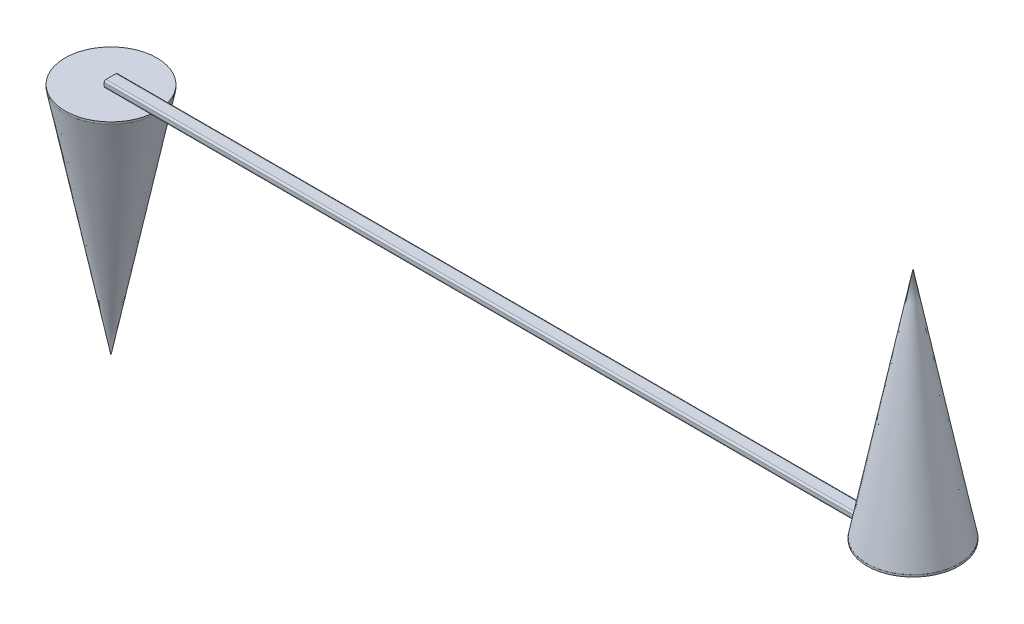
ISO-10303-21;
HEADER;
FILE_DESCRIPTION(('STEP AP214'),'2;1');
FILE_NAME('part.step','',(''),(''),'','','');
FILE_SCHEMA(('AUTOMOTIVE_DESIGN { 1 0 10303 214 1 1 1 1 }'));
ENDSEC;
DATA;
#1=APPLICATION_CONTEXT('core data for automotive mechanical design processes');
#2=APPLICATION_PROTOCOL_DEFINITION('international standard','automotive_design',2000,#1);
#3=PRODUCT_CONTEXT('',#1,'mechanical');
#4=PRODUCT('Part','Part','',(#3));
#5=PRODUCT_RELATED_PRODUCT_CATEGORY('part','',(#4));
#6=PRODUCT_DEFINITION_FORMATION('','',#4);
#7=PRODUCT_DEFINITION_CONTEXT('part definition',#1,'design');
#8=PRODUCT_DEFINITION('design','',#6,#7);
#9=PRODUCT_DEFINITION_SHAPE('','',#8);
#10=(LENGTH_UNIT() NAMED_UNIT(*) SI_UNIT(.MILLI.,.METRE.));
#11=(NAMED_UNIT(*) PLANE_ANGLE_UNIT() SI_UNIT($,.RADIAN.));
#12=(NAMED_UNIT(*) SI_UNIT($,.STERADIAN.) SOLID_ANGLE_UNIT());
#13=UNCERTAINTY_MEASURE_WITH_UNIT(LENGTH_MEASURE(1.E-05),#10,'distance_accuracy_value','');
#14=(GEOMETRIC_REPRESENTATION_CONTEXT(3) GLOBAL_UNCERTAINTY_ASSIGNED_CONTEXT((#13)) GLOBAL_UNIT_ASSIGNED_CONTEXT((#10,
#11,#12)) REPRESENTATION_CONTEXT('',''));
#15=CARTESIAN_POINT('',(0.,0.,0.));
#16=DIRECTION('',(0.,0.,1.));
#17=DIRECTION('',(1.,0.,0.));
#18=AXIS2_PLACEMENT_3D('',#15,#16,#17);
#19=CARTESIAN_POINT('',(-600.,-337.761394114607,12.3));
#20=DIRECTION('',(0.,1.,0.));
#21=DIRECTION('',(0.,0.,1.));
#22=AXIS2_PLACEMENT_3D('',#19,#20,#21);
#23=CONICAL_SURFACE('',#22,0.,0.195273157394693);
#24=CARTESIAN_POINT('',(-600.,-10.4,12.3));
#25=DIRECTION('',(0.,1.,0.));
#26=DIRECTION('',(0.,0.,1.));
#27=AXIS2_PLACEMENT_3D('',#24,#25,#26);
#28=CIRCLE('',#27,64.75);
#29=CARTESIAN_POINT('',(-600.,-10.4,77.05));
#30=VERTEX_POINT('',#29);
#31=EDGE_CURVE('E14',#30,#30,#28,.T.);
#32=ORIENTED_EDGE('',*,*,#31,.T.);
#33=EDGE_LOOP('',(#32));
#34=FACE_BOUND('',#33,.T.);
#35=CARTESIAN_POINT('',(-600.,-337.761394114607,12.3));
#36=VERTEX_POINT('',#35);
#37=VERTEX_LOOP('',#36);
#38=FACE_BOUND('',#37,.T.);
#39=ADVANCED_FACE('F89',(#34,#38),#23,.F.);
#40=CARTESIAN_POINT('',(-600.,-10.4,77.05));
#41=DIRECTION('',(0.,1.,0.));
#42=DIRECTION('',(0.,0.,1.));
#43=AXIS2_PLACEMENT_3D('',#40,#41,#42);
#44=PLANE('',#43);
#45=CARTESIAN_POINT('',(-600.,-10.4,12.3));
#46=DIRECTION('',(0.,1.,0.));
#47=DIRECTION('',(0.,0.,1.));
#48=AXIS2_PLACEMENT_3D('',#45,#46,#47);
#49=CIRCLE('',#48,68.75);
#50=CARTESIAN_POINT('',(-600.,-10.4,81.05));
#51=VERTEX_POINT('',#50);
#52=EDGE_CURVE('E96',#51,#51,#49,.T.);
#53=ORIENTED_EDGE('',*,*,#52,.T.);
#54=EDGE_LOOP('',(#53));
#55=FACE_BOUND('',#54,.T.);
#56=ORIENTED_EDGE('',*,*,#31,.F.);
#57=EDGE_LOOP('',(#56));
#58=FACE_BOUND('',#57,.T.);
#59=ADVANCED_FACE('F103',(#55,#58),#44,.T.);
#60=CARTESIAN_POINT('',(-600.,-10.4,12.3));
#61=DIRECTION('',(0.,1.,0.));
#62=DIRECTION('',(0.,0.,1.));
#63=AXIS2_PLACEMENT_3D('',#60,#61,#62);
#64=CONICAL_SURFACE('',#63,68.75,0.195045875162359);
#65=CARTESIAN_POINT('',(-600.,-358.4,12.3));
#66=VERTEX_POINT('',#65);
#67=VERTEX_LOOP('',#66);
#68=FACE_BOUND('',#67,.T.);
#69=ORIENTED_EDGE('',*,*,#52,.F.);
#70=EDGE_LOOP('',(#69));
#71=FACE_BOUND('',#70,.T.);
#72=ADVANCED_FACE('F108',(#68,#71),#64,.T.);
#73=CLOSED_SHELL('',(#39,#59,#72));
#74=MANIFOLD_SOLID_BREP('B2',#73);
#75=CARTESIAN_POINT('',(600.,5.8,-52.3123326641914));
#76=DIRECTION('',(0.,-1.,0.));
#77=DIRECTION('',(0.,0.,-1.));
#78=AXIS2_PLACEMENT_3D('',#75,#76,#77);
#79=PLANE('',#78);
#80=CARTESIAN_POINT('',(600.,5.8,12.3));
#81=DIRECTION('',(0.,-1.,0.));
#82=DIRECTION('',(0.,0.,-1.));
#83=AXIS2_PLACEMENT_3D('',#80,#81,#82);
#84=CIRCLE('',#83,68.6123326641915);
#85=CARTESIAN_POINT('',(600.,5.8,-56.3123326641915));
#86=VERTEX_POINT('',#85);
#87=EDGE_CURVE('E151',#86,#86,#84,.T.);
#88=ORIENTED_EDGE('',*,*,#87,.T.);
#89=EDGE_LOOP('',(#88));
#90=FACE_BOUND('',#89,.T.);
#91=CARTESIAN_POINT('',(600.,5.8,12.3));
#92=DIRECTION('',(0.,-1.,0.));
#93=DIRECTION('',(0.,0.,-1.));
#94=AXIS2_PLACEMENT_3D('',#91,#92,#93);
#95=CIRCLE('',#94,64.6123326641914);
#96=CARTESIAN_POINT('',(600.,5.8,-52.3123326641914));
#97=VERTEX_POINT('',#96);
#98=EDGE_CURVE('E87',#97,#97,#95,.T.);
#99=ORIENTED_EDGE('',*,*,#98,.F.);
#100=EDGE_LOOP('',(#99));
#101=FACE_BOUND('',#100,.T.);
#102=ADVANCED_FACE('F144',(#90,#101),#79,.T.);
#103=CARTESIAN_POINT('',(600.,333.12153774248,12.3));
#104=DIRECTION('',(0.,-1.,0.));
#105=DIRECTION('',(0.,0.,-1.));
#106=AXIS2_PLACEMENT_3D('',#103,#104,#105);
#107=CONICAL_SURFACE('',#106,0.,0.194891553628);
#108=ORIENTED_EDGE('',*,*,#98,.T.);
#109=EDGE_LOOP('',(#108));
#110=FACE_BOUND('',#109,.T.);
#111=CARTESIAN_POINT('',(600.,333.12153774248,12.3));
#112=VERTEX_POINT('',#111);
#113=VERTEX_LOOP('',#112);
#114=FACE_BOUND('',#113,.T.);
#115=ADVANCED_FACE('F160',(#110,#114),#107,.F.);
#116=CARTESIAN_POINT('',(600.,5.8,12.3));
#117=DIRECTION('',(0.,-1.,0.));
#118=DIRECTION('',(0.,0.,-1.));
#119=AXIS2_PLACEMENT_3D('',#116,#117,#118);
#120=CONICAL_SURFACE('',#119,68.6123326641915,0.194665110478559);
#121=CARTESIAN_POINT('',(600.,353.8,12.3));
#122=VERTEX_POINT('',#121);
#123=VERTEX_LOOP('',#122);
#124=FACE_BOUND('',#123,.T.);
#125=ORIENTED_EDGE('',*,*,#87,.F.);
#126=EDGE_LOOP('',(#125));
#127=FACE_BOUND('',#126,.T.);
#128=ADVANCED_FACE('F157',(#124,#127),#120,.T.);
#129=CLOSED_SHELL('',(#102,#115,#128));
#130=MANIFOLD_SOLID_BREP('B8',#129);
#131=CARTESIAN_POINT('',(-600.,-10.4,12.3));
#132=DIRECTION('',(0.,1.,0.));
#133=DIRECTION('',(0.,0.,1.));
#134=AXIS2_PLACEMENT_3D('',#131,#132,#133);
#135=CYLINDRICAL_SURFACE('',#134,68.75);
#136=CARTESIAN_POINT('',(-600.,-10.4,12.3));
#137=DIRECTION('',(0.,-1.,0.));
#138=DIRECTION('',(0.,0.,-1.));
#139=AXIS2_PLACEMENT_3D('',#136,#137,#138);
#140=CIRCLE('',#139,68.75);
#141=CARTESIAN_POINT('',(-600.,-10.4,-56.45));
#142=VERTEX_POINT('',#141);
#143=EDGE_CURVE('E143',#142,#142,#140,.T.);
#144=ORIENTED_EDGE('',*,*,#143,.F.);
#145=EDGE_LOOP('',(#144));
#146=FACE_BOUND('',#145,.T.);
#147=CARTESIAN_POINT('',(-600.,-7.4,12.3));
#148=DIRECTION('',(0.,-1.,0.));
#149=DIRECTION('',(0.,0.,-1.));
#150=AXIS2_PLACEMENT_3D('',#147,#148,#149);
#151=CIRCLE('',#150,68.75);
#152=CARTESIAN_POINT('',(-600.,-7.39999999999998,-56.45));
#153=VERTEX_POINT('',#152);
#154=EDGE_CURVE('E196',#153,#153,#151,.T.);
#155=ORIENTED_EDGE('',*,*,#154,.T.);
#156=EDGE_LOOP('',(#155));
#157=FACE_BOUND('',#156,.T.);
#158=ADVANCED_FACE('F193',(#146,#157),#135,.T.);
#159=CARTESIAN_POINT('',(-600.,-10.4,12.3));
#160=DIRECTION('',(0.,-1.,0.));
#161=DIRECTION('',(0.,0.,-1.));
#162=AXIS2_PLACEMENT_3D('',#159,#160,#161);
#163=PLANE('',#162);
#164=ORIENTED_EDGE('',*,*,#143,.T.);
#165=EDGE_LOOP('',(#164));
#166=FACE_BOUND('',#165,.T.);
#167=ADVANCED_FACE('F208',(#166),#163,.T.);
#168=CARTESIAN_POINT('',(-600.,-7.4,12.3));
#169=DIRECTION('',(0.,-1.,0.));
#170=DIRECTION('',(0.,0.,-1.));
#171=AXIS2_PLACEMENT_3D('',#168,#169,#170);
#172=PLANE('',#171);
#173=ORIENTED_EDGE('',*,*,#154,.F.);
#174=EDGE_LOOP('',(#173));
#175=FACE_BOUND('',#174,.T.);
#176=ADVANCED_FACE('F206',(#175),#172,.F.);
#177=CLOSED_SHELL('',(#158,#167,#176));
#178=MANIFOLD_SOLID_BREP('B81',#177);
#179=CARTESIAN_POINT('',(0.,2.8,0.));
#180=DIRECTION('',(0.,1.,0.));
#181=DIRECTION('',(0.,0.,1.));
#182=AXIS2_PLACEMENT_3D('',#179,#180,#181);
#183=PLANE('',#182);
#184=CARTESIAN_POINT('',(600.,2.8,12.3));
#185=DIRECTION('',(0.,1.,0.));
#186=DIRECTION('',(0.,0.,1.));
#187=AXIS2_PLACEMENT_3D('',#184,#185,#186);
#188=CIRCLE('',#187,68.75);
#189=CARTESIAN_POINT('',(600.,2.8,81.05));
#190=VERTEX_POINT('',#189);
#191=EDGE_CURVE('E249',#190,#190,#188,.T.);
#192=ORIENTED_EDGE('',*,*,#191,.F.);
#193=EDGE_LOOP('',(#192));
#194=FACE_BOUND('',#193,.T.);
#195=ADVANCED_FACE('F243',(#194),#183,.F.);
#196=CARTESIAN_POINT('',(0.,5.8,0.));
#197=DIRECTION('',(0.,1.,0.));
#198=DIRECTION('',(0.,0.,1.));
#199=AXIS2_PLACEMENT_3D('',#196,#197,#198);
#200=PLANE('',#199);
#201=CARTESIAN_POINT('',(600.,5.8,12.3));
#202=DIRECTION('',(0.,1.,0.));
#203=DIRECTION('',(0.,0.,1.));
#204=AXIS2_PLACEMENT_3D('',#201,#202,#203);
#205=CIRCLE('',#204,68.75);
#206=CARTESIAN_POINT('',(600.,5.8,81.05));
#207=VERTEX_POINT('',#206);
#208=EDGE_CURVE('E192',#207,#207,#205,.T.);
#209=ORIENTED_EDGE('',*,*,#208,.T.);
#210=EDGE_LOOP('',(#209));
#211=FACE_BOUND('',#210,.T.);
#212=ADVANCED_FACE('F259',(#211),#200,.T.);
#213=CARTESIAN_POINT('',(600.,2.8,12.3));
#214=DIRECTION('',(0.,1.,0.));
#215=DIRECTION('',(0.,0.,1.));
#216=AXIS2_PLACEMENT_3D('',#213,#214,#215);
#217=CYLINDRICAL_SURFACE('',#216,68.75);
#218=ORIENTED_EDGE('',*,*,#191,.T.);
#219=EDGE_LOOP('',(#218));
#220=FACE_BOUND('',#219,.T.);
#221=ORIENTED_EDGE('',*,*,#208,.F.);
#222=EDGE_LOOP('',(#221));
#223=FACE_BOUND('',#222,.T.);
#224=ADVANCED_FACE('F255',(#220,#223),#217,.T.);
#225=CLOSED_SHELL('',(#195,#212,#224));
#226=MANIFOLD_SOLID_BREP('B138',#225);
#227=CARTESIAN_POINT('',(600.,-4.8,19.8));
#228=DIRECTION('',(-1.,0.,0.));
#229=DIRECTION('',(0.,0.,1.));
#230=AXIS2_PLACEMENT_3D('',#227,#228,#229);
#231=CYLINDRICAL_SURFACE('',#230,2.6);
#232=CARTESIAN_POINT('',(-600.,-4.8,19.8));
#233=DIRECTION('',(1.,0.,0.));
#234=DIRECTION('',(0.,0.,-1.));
#235=AXIS2_PLACEMENT_3D('',#232,#233,#234);
#236=CIRCLE('',#235,2.6);
#237=CARTESIAN_POINT('',(-600.,-4.8,22.4));
#238=VERTEX_POINT('',#237);
#239=CARTESIAN_POINT('',(-600.,-7.4,19.8));
#240=VERTEX_POINT('',#239);
#241=EDGE_CURVE('E380',#238,#240,#236,.T.);
#242=ORIENTED_EDGE('',*,*,#241,.T.);
#243=DIRECTION('',(-1.,0.,0.));
#244=VECTOR('',#243,1.);
#245=CARTESIAN_POINT('',(600.,-7.4,19.8));
#246=LINE('',#245,#244);
#247=CARTESIAN_POINT('',(600.,-7.4,19.8));
#248=VERTEX_POINT('',#247);
#249=EDGE_CURVE('E241',#248,#240,#246,.T.);
#250=ORIENTED_EDGE('',*,*,#249,.F.);
#251=CARTESIAN_POINT('',(600.,-4.8,19.8));
#252=DIRECTION('',(1.,0.,0.));
#253=DIRECTION('',(0.,0.,-1.));
#254=AXIS2_PLACEMENT_3D('',#251,#252,#253);
#255=CIRCLE('',#254,2.6);
#256=CARTESIAN_POINT('',(600.,-4.8,22.4));
#257=VERTEX_POINT('',#256);
#258=EDGE_CURVE('E394',#257,#248,#255,.T.);
#259=ORIENTED_EDGE('',*,*,#258,.F.);
#260=DIRECTION('',(-1.,0.,0.));
#261=VECTOR('',#260,1.);
#262=CARTESIAN_POINT('',(600.,-4.8,22.4));
#263=LINE('',#262,#261);
#264=EDGE_CURVE('E376',#257,#238,#263,.T.);
#265=ORIENTED_EDGE('',*,*,#264,.T.);
#266=EDGE_LOOP('',(#242,#250,#259,#265));
#267=FACE_BOUND('',#266,.T.);
#268=ADVANCED_FACE('F284',(#267),#231,.T.);
#269=CARTESIAN_POINT('',(600.,-7.4,4.8));
#270=DIRECTION('',(0.,1.,0.));
#271=DIRECTION('',(0.,0.,1.));
#272=AXIS2_PLACEMENT_3D('',#269,#270,#271);
#273=PLANE('',#272);
#274=DIRECTION('',(0.,0.,-1.));
#275=VECTOR('',#274,1.);
#276=CARTESIAN_POINT('',(-600.,-7.4,4.8));
#277=LINE('',#276,#275);
#278=CARTESIAN_POINT('',(-600.,-7.4,4.8));
#279=VERTEX_POINT('',#278);
#280=EDGE_CURVE('E383',#240,#279,#277,.T.);
#281=ORIENTED_EDGE('',*,*,#280,.T.);
#282=DIRECTION('',(-1.,0.,0.));
#283=VECTOR('',#282,1.);
#284=CARTESIAN_POINT('',(600.,-7.4,4.8));
#285=LINE('',#284,#283);
#286=CARTESIAN_POINT('',(600.,-7.4,4.8));
#287=VERTEX_POINT('',#286);
#288=EDGE_CURVE('E292',#287,#279,#285,.T.);
#289=ORIENTED_EDGE('',*,*,#288,.F.);
#290=DIRECTION('',(0.,0.,-1.));
#291=VECTOR('',#290,1.);
#292=CARTESIAN_POINT('',(600.,-7.4,4.8));
#293=LINE('',#292,#291);
#294=EDGE_CURVE('E343',#248,#287,#293,.T.);
#295=ORIENTED_EDGE('',*,*,#294,.F.);
#296=ORIENTED_EDGE('',*,*,#249,.T.);
#297=EDGE_LOOP('',(#281,#289,#295,#296));
#298=FACE_BOUND('',#297,.T.);
#299=ADVANCED_FACE('F429',(#298),#273,.F.);
#300=CARTESIAN_POINT('',(600.,-4.8,4.8));
#301=DIRECTION('',(-1.,0.,0.));
#302=DIRECTION('',(0.,0.,1.));
#303=AXIS2_PLACEMENT_3D('',#300,#301,#302);
#304=CYLINDRICAL_SURFACE('',#303,2.6);
#305=CARTESIAN_POINT('',(-600.,-4.8,4.8));
#306=DIRECTION('',(1.,0.,0.));
#307=DIRECTION('',(0.,0.,-1.));
#308=AXIS2_PLACEMENT_3D('',#305,#306,#307);
#309=CIRCLE('',#308,2.6);
#310=CARTESIAN_POINT('',(-600.,-4.8,2.2));
#311=VERTEX_POINT('',#310);
#312=EDGE_CURVE('E385',#279,#311,#309,.T.);
#313=ORIENTED_EDGE('',*,*,#312,.T.);
#314=DIRECTION('',(-1.,0.,0.));
#315=VECTOR('',#314,1.);
#316=CARTESIAN_POINT('',(600.,-4.8,2.2));
#317=LINE('',#316,#315);
#318=CARTESIAN_POINT('',(600.,-4.8,2.2));
#319=VERTEX_POINT('',#318);
#320=EDGE_CURVE('E401',#319,#311,#317,.T.);
#321=ORIENTED_EDGE('',*,*,#320,.F.);
#322=CARTESIAN_POINT('',(600.,-4.8,4.8));
#323=DIRECTION('',(1.,0.,0.));
#324=DIRECTION('',(0.,0.,-1.));
#325=AXIS2_PLACEMENT_3D('',#322,#323,#324);
#326=CIRCLE('',#325,2.6);
#327=EDGE_CURVE('E409',#287,#319,#326,.T.);
#328=ORIENTED_EDGE('',*,*,#327,.F.);
#329=ORIENTED_EDGE('',*,*,#288,.T.);
#330=EDGE_LOOP('',(#313,#321,#328,#329));
#331=FACE_BOUND('',#330,.T.);
#332=ADVANCED_FACE('F407',(#331),#304,.T.);
#333=CARTESIAN_POINT('',(600.,-4.8,2.2));
#334=DIRECTION('',(0.,0.,1.));
#335=DIRECTION('',(1.,0.,0.));
#336=AXIS2_PLACEMENT_3D('',#333,#334,#335);
#337=PLANE('',#336);
#338=DIRECTION('',(0.,1.,0.));
#339=VECTOR('',#338,1.);
#340=CARTESIAN_POINT('',(-600.,-4.8,2.2));
#341=LINE('',#340,#339);
#342=CARTESIAN_POINT('',(-600.,0.200000000000005,2.2));
#343=VERTEX_POINT('',#342);
#344=EDGE_CURVE('E387',#311,#343,#341,.T.);
#345=ORIENTED_EDGE('',*,*,#344,.T.);
#346=DIRECTION('',(-1.,0.,0.));
#347=VECTOR('',#346,1.);
#348=CARTESIAN_POINT('',(600.,0.200000000000005,2.2));
#349=LINE('',#348,#347);
#350=CARTESIAN_POINT('',(600.,0.200000000000005,2.2));
#351=VERTEX_POINT('',#350);
#352=EDGE_CURVE('E398',#351,#343,#349,.T.);
#353=ORIENTED_EDGE('',*,*,#352,.F.);
#354=DIRECTION('',(0.,1.,0.));
#355=VECTOR('',#354,1.);
#356=CARTESIAN_POINT('',(600.,-4.8,2.2));
#357=LINE('',#356,#355);
#358=EDGE_CURVE('E421',#319,#351,#357,.T.);
#359=ORIENTED_EDGE('',*,*,#358,.F.);
#360=ORIENTED_EDGE('',*,*,#320,.T.);
#361=EDGE_LOOP('',(#345,#353,#359,#360));
#362=FACE_BOUND('',#361,.T.);
#363=ADVANCED_FACE('F417',(#362),#337,.F.);
#364=CARTESIAN_POINT('',(600.,0.200000000000005,4.8));
#365=DIRECTION('',(-1.,0.,0.));
#366=DIRECTION('',(0.,0.,1.));
#367=AXIS2_PLACEMENT_3D('',#364,#365,#366);
#368=CYLINDRICAL_SURFACE('',#367,2.6);
#369=CARTESIAN_POINT('',(-600.,0.200000000000005,4.8));
#370=DIRECTION('',(1.,0.,0.));
#371=DIRECTION('',(0.,0.,-1.));
#372=AXIS2_PLACEMENT_3D('',#369,#370,#371);
#373=CIRCLE('',#372,2.6);
#374=CARTESIAN_POINT('',(-600.,2.8,4.8));
#375=VERTEX_POINT('',#374);
#376=EDGE_CURVE('E389',#343,#375,#373,.T.);
#377=ORIENTED_EDGE('',*,*,#376,.T.);
#378=DIRECTION('',(-1.,0.,0.));
#379=VECTOR('',#378,1.);
#380=CARTESIAN_POINT('',(600.,2.8,4.8));
#381=LINE('',#380,#379);
#382=CARTESIAN_POINT('',(600.,2.8,4.8));
#383=VERTEX_POINT('',#382);
#384=EDGE_CURVE('E371',#383,#375,#381,.T.);
#385=ORIENTED_EDGE('',*,*,#384,.F.);
#386=CARTESIAN_POINT('',(600.,0.200000000000005,4.8));
#387=DIRECTION('',(1.,0.,0.));
#388=DIRECTION('',(0.,0.,-1.));
#389=AXIS2_PLACEMENT_3D('',#386,#387,#388);
#390=CIRCLE('',#389,2.6);
#391=EDGE_CURVE('E362',#351,#383,#390,.T.);
#392=ORIENTED_EDGE('',*,*,#391,.F.);
#393=ORIENTED_EDGE('',*,*,#352,.T.);
#394=EDGE_LOOP('',(#377,#385,#392,#393));
#395=FACE_BOUND('',#394,.T.);
#396=ADVANCED_FACE('F420',(#395),#368,.T.);
#397=CARTESIAN_POINT('',(600.,2.8,19.8));
#398=DIRECTION('',(0.,-1.,0.));
#399=DIRECTION('',(0.,0.,-1.));
#400=AXIS2_PLACEMENT_3D('',#397,#398,#399);
#401=PLANE('',#400);
#402=DIRECTION('',(0.,0.,1.));
#403=VECTOR('',#402,1.);
#404=CARTESIAN_POINT('',(-600.,2.8,19.8));
#405=LINE('',#404,#403);
#406=CARTESIAN_POINT('',(-600.,2.8,19.8));
#407=VERTEX_POINT('',#406);
#408=EDGE_CURVE('E370',#375,#407,#405,.T.);
#409=ORIENTED_EDGE('',*,*,#408,.T.);
#410=DIRECTION('',(-1.,0.,0.));
#411=VECTOR('',#410,1.);
#412=CARTESIAN_POINT('',(600.,2.8,19.8));
#413=LINE('',#412,#411);
#414=CARTESIAN_POINT('',(600.,2.8,19.8));
#415=VERTEX_POINT('',#414);
#416=EDGE_CURVE('E367',#415,#407,#413,.T.);
#417=ORIENTED_EDGE('',*,*,#416,.F.);
#418=DIRECTION('',(0.,0.,1.));
#419=VECTOR('',#418,1.);
#420=CARTESIAN_POINT('',(600.,2.8,19.8));
#421=LINE('',#420,#419);
#422=EDGE_CURVE('E356',#383,#415,#421,.T.);
#423=ORIENTED_EDGE('',*,*,#422,.F.);
#424=ORIENTED_EDGE('',*,*,#384,.T.);
#425=EDGE_LOOP('',(#409,#417,#423,#424));
#426=FACE_BOUND('',#425,.T.);
#427=ADVANCED_FACE('F368',(#426),#401,.F.);
#428=CARTESIAN_POINT('',(600.,0.200000000000001,19.8));
#429=DIRECTION('',(-1.,0.,0.));
#430=DIRECTION('',(0.,0.,1.));
#431=AXIS2_PLACEMENT_3D('',#428,#429,#430);
#432=CYLINDRICAL_SURFACE('',#431,2.6);
#433=CARTESIAN_POINT('',(-600.,0.200000000000001,19.8));
#434=DIRECTION('',(1.,0.,0.));
#435=DIRECTION('',(0.,0.,-1.));
#436=AXIS2_PLACEMENT_3D('',#433,#434,#435);
#437=CIRCLE('',#436,2.6);
#438=CARTESIAN_POINT('',(-600.,0.200000000000001,22.4));
#439=VERTEX_POINT('',#438);
#440=EDGE_CURVE('E329',#407,#439,#437,.T.);
#441=ORIENTED_EDGE('',*,*,#440,.T.);
#442=DIRECTION('',(-1.,0.,0.));
#443=VECTOR('',#442,1.);
#444=CARTESIAN_POINT('',(600.,0.200000000000001,22.4));
#445=LINE('',#444,#443);
#446=CARTESIAN_POINT('',(600.,0.200000000000001,22.4));
#447=VERTEX_POINT('',#446);
#448=EDGE_CURVE('E372',#447,#439,#445,.T.);
#449=ORIENTED_EDGE('',*,*,#448,.F.);
#450=CARTESIAN_POINT('',(600.,0.200000000000001,19.8));
#451=DIRECTION('',(1.,0.,0.));
#452=DIRECTION('',(0.,0.,-1.));
#453=AXIS2_PLACEMENT_3D('',#450,#451,#452);
#454=CIRCLE('',#453,2.6);
#455=EDGE_CURVE('E360',#415,#447,#454,.T.);
#456=ORIENTED_EDGE('',*,*,#455,.F.);
#457=ORIENTED_EDGE('',*,*,#416,.T.);
#458=EDGE_LOOP('',(#441,#449,#456,#457));
#459=FACE_BOUND('',#458,.T.);
#460=ADVANCED_FACE('F374',(#459),#432,.T.);
#461=CARTESIAN_POINT('',(600.,0.200000000000001,22.4));
#462=DIRECTION('',(0.,0.,-1.));
#463=DIRECTION('',(-1.,0.,0.));
#464=AXIS2_PLACEMENT_3D('',#461,#462,#463);
#465=PLANE('',#464);
#466=DIRECTION('',(0.,-1.,0.));
#467=VECTOR('',#466,1.);
#468=CARTESIAN_POINT('',(-600.,0.200000000000001,22.4));
#469=LINE('',#468,#467);
#470=EDGE_CURVE('E335',#439,#238,#469,.T.);
#471=ORIENTED_EDGE('',*,*,#470,.T.);
#472=ORIENTED_EDGE('',*,*,#264,.F.);
#473=DIRECTION('',(0.,-1.,0.));
#474=VECTOR('',#473,1.);
#475=CARTESIAN_POINT('',(600.,0.200000000000001,22.4));
#476=LINE('',#475,#474);
#477=EDGE_CURVE('E300',#447,#257,#476,.T.);
#478=ORIENTED_EDGE('',*,*,#477,.F.);
#479=ORIENTED_EDGE('',*,*,#448,.T.);
#480=EDGE_LOOP('',(#471,#472,#478,#479));
#481=FACE_BOUND('',#480,.T.);
#482=ADVANCED_FACE('F445',(#481),#465,.F.);
#483=CARTESIAN_POINT('',(600.,-4.8,19.8));
#484=DIRECTION('',(1.,0.,0.));
#485=DIRECTION('',(0.,0.,-1.));
#486=AXIS2_PLACEMENT_3D('',#483,#484,#485);
#487=PLANE('',#486);
#488=ORIENTED_EDGE('',*,*,#258,.T.);
#489=ORIENTED_EDGE('',*,*,#294,.T.);
#490=ORIENTED_EDGE('',*,*,#327,.T.);
#491=ORIENTED_EDGE('',*,*,#358,.T.);
#492=ORIENTED_EDGE('',*,*,#391,.T.);
#493=ORIENTED_EDGE('',*,*,#422,.T.);
#494=ORIENTED_EDGE('',*,*,#455,.T.);
#495=ORIENTED_EDGE('',*,*,#477,.T.);
#496=EDGE_LOOP('',(#488,#489,#490,#491,#492,#493,#494,#495));
#497=FACE_BOUND('',#496,.T.);
#498=ADVANCED_FACE('F358',(#497),#487,.T.);
#499=CARTESIAN_POINT('',(-600.,-4.8,19.8));
#500=DIRECTION('',(1.,0.,0.));
#501=DIRECTION('',(0.,0.,-1.));
#502=AXIS2_PLACEMENT_3D('',#499,#500,#501);
#503=PLANE('',#502);
#504=ORIENTED_EDGE('',*,*,#241,.F.);
#505=ORIENTED_EDGE('',*,*,#470,.F.);
#506=ORIENTED_EDGE('',*,*,#440,.F.);
#507=ORIENTED_EDGE('',*,*,#408,.F.);
#508=ORIENTED_EDGE('',*,*,#376,.F.);
#509=ORIENTED_EDGE('',*,*,#344,.F.);
#510=ORIENTED_EDGE('',*,*,#312,.F.);
#511=ORIENTED_EDGE('',*,*,#280,.F.);
#512=EDGE_LOOP('',(#504,#505,#506,#507,#508,#509,#510,#511));
#513=FACE_BOUND('',#512,.T.);
#514=ADVANCED_FACE('F413',(#513),#503,.F.);
#515=CLOSED_SHELL('',(#268,#299,#332,#363,#396,#427,#460,#482,#498,#514));
#516=MANIFOLD_SOLID_BREP('B187',#515);
#517=ADVANCED_BREP_SHAPE_REPRESENTATION('',(#18,#74,#130,#178,#226,#516),#14);
#518=SHAPE_DEFINITION_REPRESENTATION(#9,#517);
ENDSEC;
END-ISO-10303-21;
